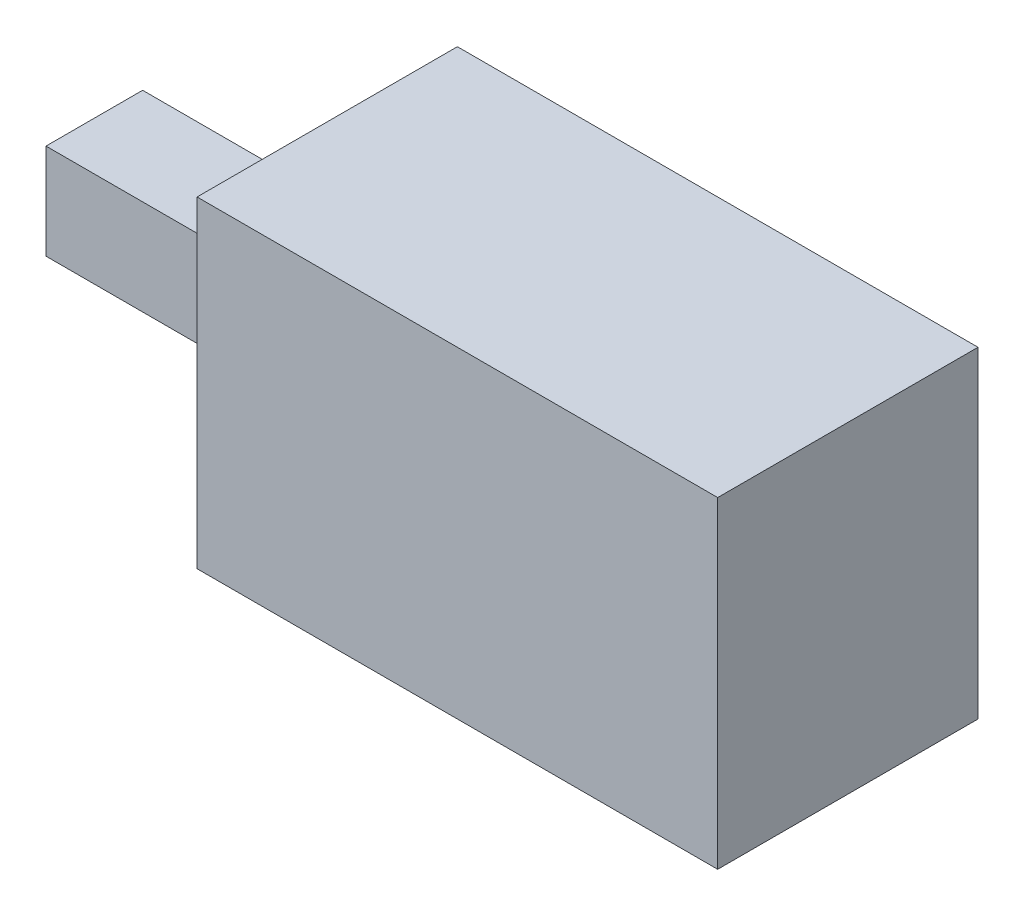
ISO-10303-21;
HEADER;
FILE_DESCRIPTION(('STEP AP214'),'2;1');
FILE_NAME('part.step','',(''),(''),'','','');
FILE_SCHEMA(('AUTOMOTIVE_DESIGN { 1 0 10303 214 1 1 1 1 }'));
ENDSEC;
DATA;
#1=APPLICATION_CONTEXT('core data for automotive mechanical design processes');
#2=APPLICATION_PROTOCOL_DEFINITION('international standard','automotive_design',2000,#1);
#3=PRODUCT_CONTEXT('',#1,'mechanical');
#4=PRODUCT('Part','Part','',(#3));
#5=PRODUCT_RELATED_PRODUCT_CATEGORY('part','',(#4));
#6=PRODUCT_DEFINITION_FORMATION('','',#4);
#7=PRODUCT_DEFINITION_CONTEXT('part definition',#1,'design');
#8=PRODUCT_DEFINITION('design','',#6,#7);
#9=PRODUCT_DEFINITION_SHAPE('','',#8);
#10=(LENGTH_UNIT() NAMED_UNIT(*) SI_UNIT(.MILLI.,.METRE.));
#11=(NAMED_UNIT(*) PLANE_ANGLE_UNIT() SI_UNIT($,.RADIAN.));
#12=(NAMED_UNIT(*) SI_UNIT($,.STERADIAN.) SOLID_ANGLE_UNIT());
#13=UNCERTAINTY_MEASURE_WITH_UNIT(LENGTH_MEASURE(1.E-05),#10,'distance_accuracy_value','');
#14=(GEOMETRIC_REPRESENTATION_CONTEXT(3) GLOBAL_UNCERTAINTY_ASSIGNED_CONTEXT((#13)) GLOBAL_UNIT_ASSIGNED_CONTEXT((#10,
#11,#12)) REPRESENTATION_CONTEXT('',''));
#15=CARTESIAN_POINT('',(0.,0.,0.));
#16=DIRECTION('',(0.,0.,1.));
#17=DIRECTION('',(1.,0.,0.));
#18=AXIS2_PLACEMENT_3D('',#15,#16,#17);
#19=CARTESIAN_POINT('',(-38.,47.,-19.));
#20=DIRECTION('',(1.,0.,0.));
#21=DIRECTION('',(0.,0.,-1.));
#22=AXIS2_PLACEMENT_3D('',#19,#20,#21);
#23=PLANE('',#22);
#24=DIRECTION('',(0.,0.,1.));
#25=VECTOR('',#24,1.);
#26=CARTESIAN_POINT('',(-38.,0.,-19.));
#27=LINE('',#26,#25);
#28=CARTESIAN_POINT('',(-38.,0.,-19.));
#29=VERTEX_POINT('',#28);
#30=CARTESIAN_POINT('',(-38.,0.,19.));
#31=VERTEX_POINT('',#30);
#32=EDGE_CURVE('E165',#29,#31,#27,.T.);
#33=ORIENTED_EDGE('',*,*,#32,.T.);
#34=DIRECTION('',(0.,-1.,0.));
#35=VECTOR('',#34,1.);
#36=CARTESIAN_POINT('',(-38.,47.,19.));
#37=LINE('',#36,#35);
#38=CARTESIAN_POINT('',(-38.,47.,19.));
#39=VERTEX_POINT('',#38);
#40=EDGE_CURVE('E168',#39,#31,#37,.T.);
#41=ORIENTED_EDGE('',*,*,#40,.F.);
#42=DIRECTION('',(0.,0.,1.));
#43=VECTOR('',#42,1.);
#44=CARTESIAN_POINT('',(-38.,47.,-19.));
#45=LINE('',#44,#43);
#46=CARTESIAN_POINT('',(-38.,47.,-19.));
#47=VERTEX_POINT('',#46);
#48=EDGE_CURVE('E153',#47,#39,#45,.T.);
#49=ORIENTED_EDGE('',*,*,#48,.F.);
#50=DIRECTION('',(0.,-1.,0.));
#51=VECTOR('',#50,1.);
#52=CARTESIAN_POINT('',(-38.,47.,-19.));
#53=LINE('',#52,#51);
#54=EDGE_CURVE('E53',#47,#29,#53,.T.);
#55=ORIENTED_EDGE('',*,*,#54,.T.);
#56=EDGE_LOOP('',(#33,#41,#49,#55));
#57=FACE_BOUND('',#56,.T.);
#58=DIRECTION('',(0.,1.,0.));
#59=VECTOR('',#58,1.);
#60=CARTESIAN_POINT('',(-38.,30.4621516002449,7.05316011789549));
#61=LINE('',#60,#59);
#62=CARTESIAN_POINT('',(-38.,16.5378483997551,7.05316011789549));
#63=VERTEX_POINT('',#62);
#64=CARTESIAN_POINT('',(-38.,30.4621516002449,7.05316011789549));
#65=VERTEX_POINT('',#64);
#66=EDGE_CURVE('E62',#63,#65,#61,.T.);
#67=ORIENTED_EDGE('',*,*,#66,.F.);
#68=DIRECTION('',(0.,0.,1.));
#69=VECTOR('',#68,1.);
#70=CARTESIAN_POINT('',(-38.,16.5378483997551,-7.05316011789548));
#71=LINE('',#70,#69);
#72=CARTESIAN_POINT('',(-38.,16.5378483997551,-7.05316011789548));
#73=VERTEX_POINT('',#72);
#74=EDGE_CURVE('E63',#73,#63,#71,.T.);
#75=ORIENTED_EDGE('',*,*,#74,.F.);
#76=DIRECTION('',(0.,-1.,0.));
#77=VECTOR('',#76,1.);
#78=CARTESIAN_POINT('',(-38.,30.4621516002449,-7.05316011789548));
#79=LINE('',#78,#77);
#80=CARTESIAN_POINT('',(-38.,30.4621516002449,-7.05316011789548));
#81=VERTEX_POINT('',#80);
#82=EDGE_CURVE('E286',#81,#73,#79,.T.);
#83=ORIENTED_EDGE('',*,*,#82,.F.);
#84=DIRECTION('',(0.,0.,-1.));
#85=VECTOR('',#84,1.);
#86=CARTESIAN_POINT('',(-38.,30.4621516002449,-7.05316011789548));
#87=LINE('',#86,#85);
#88=EDGE_CURVE('E296',#65,#81,#87,.T.);
#89=ORIENTED_EDGE('',*,*,#88,.F.);
#90=EDGE_LOOP('',(#67,#75,#83,#89));
#91=FACE_BOUND('',#90,.T.);
#92=ADVANCED_FACE('F44',(#57,#91),#23,.F.);
#93=CARTESIAN_POINT('',(38.,47.,-19.));
#94=DIRECTION('',(-1.,0.,0.));
#95=DIRECTION('',(0.,0.,1.));
#96=AXIS2_PLACEMENT_3D('',#93,#94,#95);
#97=PLANE('',#96);
#98=DIRECTION('',(0.,0.,-1.));
#99=VECTOR('',#98,1.);
#100=CARTESIAN_POINT('',(38.,0.,-19.));
#101=LINE('',#100,#99);
#102=CARTESIAN_POINT('',(38.,0.,19.));
#103=VERTEX_POINT('',#102);
#104=CARTESIAN_POINT('',(38.,0.,-19.));
#105=VERTEX_POINT('',#104);
#106=EDGE_CURVE('E131',#103,#105,#101,.T.);
#107=ORIENTED_EDGE('',*,*,#106,.T.);
#108=DIRECTION('',(0.,-1.,0.));
#109=VECTOR('',#108,1.);
#110=CARTESIAN_POINT('',(38.,47.,-19.));
#111=LINE('',#110,#109);
#112=CARTESIAN_POINT('',(38.,47.,-19.));
#113=VERTEX_POINT('',#112);
#114=EDGE_CURVE('E11',#113,#105,#111,.T.);
#115=ORIENTED_EDGE('',*,*,#114,.F.);
#116=DIRECTION('',(0.,0.,-1.));
#117=VECTOR('',#116,1.);
#118=CARTESIAN_POINT('',(38.,47.,-19.));
#119=LINE('',#118,#117);
#120=CARTESIAN_POINT('',(38.,47.,19.));
#121=VERTEX_POINT('',#120);
#122=EDGE_CURVE('E144',#121,#113,#119,.T.);
#123=ORIENTED_EDGE('',*,*,#122,.F.);
#124=DIRECTION('',(0.,-1.,0.));
#125=VECTOR('',#124,1.);
#126=CARTESIAN_POINT('',(38.,47.,19.));
#127=LINE('',#126,#125);
#128=EDGE_CURVE('E158',#121,#103,#127,.T.);
#129=ORIENTED_EDGE('',*,*,#128,.T.);
#130=EDGE_LOOP('',(#107,#115,#123,#129));
#131=FACE_BOUND('',#130,.T.);
#132=ADVANCED_FACE('F50',(#131),#97,.F.);
#133=CARTESIAN_POINT('',(-38.,47.,-19.));
#134=DIRECTION('',(0.,0.,1.));
#135=DIRECTION('',(1.,0.,0.));
#136=AXIS2_PLACEMENT_3D('',#133,#134,#135);
#137=PLANE('',#136);
#138=DIRECTION('',(-1.,0.,0.));
#139=VECTOR('',#138,1.);
#140=CARTESIAN_POINT('',(-38.,0.,-19.));
#141=LINE('',#140,#139);
#142=EDGE_CURVE('E136',#105,#29,#141,.T.);
#143=ORIENTED_EDGE('',*,*,#142,.T.);
#144=ORIENTED_EDGE('',*,*,#54,.F.);
#145=DIRECTION('',(-1.,0.,0.));
#146=VECTOR('',#145,1.);
#147=CARTESIAN_POINT('',(-38.,47.,-19.));
#148=LINE('',#147,#146);
#149=EDGE_CURVE('E149',#113,#47,#148,.T.);
#150=ORIENTED_EDGE('',*,*,#149,.F.);
#151=ORIENTED_EDGE('',*,*,#114,.T.);
#152=EDGE_LOOP('',(#143,#144,#150,#151));
#153=FACE_BOUND('',#152,.T.);
#154=ADVANCED_FACE('F191',(#153),#137,.F.);
#155=CARTESIAN_POINT('',(-38.,47.,19.));
#156=DIRECTION('',(0.,0.,-1.));
#157=DIRECTION('',(-1.,0.,0.));
#158=AXIS2_PLACEMENT_3D('',#155,#156,#157);
#159=PLANE('',#158);
#160=DIRECTION('',(1.,0.,0.));
#161=VECTOR('',#160,1.);
#162=CARTESIAN_POINT('',(-38.,0.,19.));
#163=LINE('',#162,#161);
#164=EDGE_CURVE('E147',#31,#103,#163,.T.);
#165=ORIENTED_EDGE('',*,*,#164,.T.);
#166=ORIENTED_EDGE('',*,*,#128,.F.);
#167=DIRECTION('',(1.,0.,0.));
#168=VECTOR('',#167,1.);
#169=CARTESIAN_POINT('',(-38.,47.,19.));
#170=LINE('',#169,#168);
#171=EDGE_CURVE('E156',#39,#121,#170,.T.);
#172=ORIENTED_EDGE('',*,*,#171,.F.);
#173=ORIENTED_EDGE('',*,*,#40,.T.);
#174=EDGE_LOOP('',(#165,#166,#172,#173));
#175=FACE_BOUND('',#174,.T.);
#176=ADVANCED_FACE('F190',(#175),#159,.F.);
#177=CARTESIAN_POINT('',(0.,47.,0.));
#178=DIRECTION('',(0.,1.,0.));
#179=DIRECTION('',(0.,0.,1.));
#180=AXIS2_PLACEMENT_3D('',#177,#178,#179);
#181=PLANE('',#180);
#182=ORIENTED_EDGE('',*,*,#122,.T.);
#183=ORIENTED_EDGE('',*,*,#149,.T.);
#184=ORIENTED_EDGE('',*,*,#48,.T.);
#185=ORIENTED_EDGE('',*,*,#171,.T.);
#186=EDGE_LOOP('',(#182,#183,#184,#185));
#187=FACE_BOUND('',#186,.T.);
#188=ADVANCED_FACE('F195',(#187),#181,.T.);
#189=CARTESIAN_POINT('',(0.,0.,0.));
#190=DIRECTION('',(0.,1.,0.));
#191=DIRECTION('',(0.,0.,1.));
#192=AXIS2_PLACEMENT_3D('',#189,#190,#191);
#193=PLANE('',#192);
#194=ORIENTED_EDGE('',*,*,#106,.F.);
#195=ORIENTED_EDGE('',*,*,#164,.F.);
#196=ORIENTED_EDGE('',*,*,#32,.F.);
#197=ORIENTED_EDGE('',*,*,#142,.F.);
#198=EDGE_LOOP('',(#194,#195,#196,#197));
#199=FACE_BOUND('',#198,.T.);
#200=ADVANCED_FACE('F184',(#199),#193,.F.);
#201=CARTESIAN_POINT('',(-72.,30.4621516002449,7.0531601178955));
#202=DIRECTION('',(0.,0.,-1.));
#203=DIRECTION('',(-1.,0.,0.));
#204=AXIS2_PLACEMENT_3D('',#201,#202,#203);
#205=PLANE('',#204);
#206=ORIENTED_EDGE('',*,*,#66,.T.);
#207=DIRECTION('',(1.,0.,0.));
#208=VECTOR('',#207,1.);
#209=CARTESIAN_POINT('',(-72.,30.4621516002449,7.0531601178955));
#210=LINE('',#209,#208);
#211=CARTESIAN_POINT('',(-72.,30.4621516002449,7.0531601178955));
#212=VERTEX_POINT('',#211);
#213=EDGE_CURVE('E111',#212,#65,#210,.T.);
#214=ORIENTED_EDGE('',*,*,#213,.F.);
#215=DIRECTION('',(0.,1.,0.));
#216=VECTOR('',#215,1.);
#217=CARTESIAN_POINT('',(-72.,30.4621516002449,7.0531601178955));
#218=LINE('',#217,#216);
#219=CARTESIAN_POINT('',(-72.,16.5378483997551,7.0531601178955));
#220=VERTEX_POINT('',#219);
#221=EDGE_CURVE('E122',#220,#212,#218,.T.);
#222=ORIENTED_EDGE('',*,*,#221,.F.);
#223=DIRECTION('',(1.,0.,0.));
#224=VECTOR('',#223,1.);
#225=CARTESIAN_POINT('',(-72.,16.5378483997551,7.0531601178955));
#226=LINE('',#225,#224);
#227=EDGE_CURVE('E287',#220,#63,#226,.T.);
#228=ORIENTED_EDGE('',*,*,#227,.T.);
#229=EDGE_LOOP('',(#206,#214,#222,#228));
#230=FACE_BOUND('',#229,.T.);
#231=ADVANCED_FACE('F135',(#230),#205,.F.);
#232=CARTESIAN_POINT('',(-72.,30.4621516002449,-7.05316011789547));
#233=DIRECTION('',(0.,-1.,0.));
#234=DIRECTION('',(0.,0.,-1.));
#235=AXIS2_PLACEMENT_3D('',#232,#233,#234);
#236=PLANE('',#235);
#237=ORIENTED_EDGE('',*,*,#88,.T.);
#238=DIRECTION('',(1.,0.,0.));
#239=VECTOR('',#238,1.);
#240=CARTESIAN_POINT('',(-72.,30.4621516002449,-7.05316011789547));
#241=LINE('',#240,#239);
#242=CARTESIAN_POINT('',(-72.,30.4621516002449,-7.05316011789547));
#243=VERTEX_POINT('',#242);
#244=EDGE_CURVE('E117',#243,#81,#241,.T.);
#245=ORIENTED_EDGE('',*,*,#244,.F.);
#246=DIRECTION('',(0.,0.,-1.));
#247=VECTOR('',#246,1.);
#248=CARTESIAN_POINT('',(-72.,30.4621516002449,-7.05316011789547));
#249=LINE('',#248,#247);
#250=EDGE_CURVE('E108',#212,#243,#249,.T.);
#251=ORIENTED_EDGE('',*,*,#250,.F.);
#252=ORIENTED_EDGE('',*,*,#213,.T.);
#253=EDGE_LOOP('',(#237,#245,#251,#252));
#254=FACE_BOUND('',#253,.T.);
#255=ADVANCED_FACE('F115',(#254),#236,.F.);
#256=CARTESIAN_POINT('',(-72.,30.4621516002449,-7.05316011789547));
#257=DIRECTION('',(0.,0.,1.));
#258=DIRECTION('',(1.,0.,0.));
#259=AXIS2_PLACEMENT_3D('',#256,#257,#258);
#260=PLANE('',#259);
#261=ORIENTED_EDGE('',*,*,#82,.T.);
#262=DIRECTION('',(1.,0.,0.));
#263=VECTOR('',#262,1.);
#264=CARTESIAN_POINT('',(-72.,16.5378483997551,-7.05316011789547));
#265=LINE('',#264,#263);
#266=CARTESIAN_POINT('',(-72.,16.5378483997551,-7.05316011789547));
#267=VERTEX_POINT('',#266);
#268=EDGE_CURVE('E143',#267,#73,#265,.T.);
#269=ORIENTED_EDGE('',*,*,#268,.F.);
#270=DIRECTION('',(0.,-1.,0.));
#271=VECTOR('',#270,1.);
#272=CARTESIAN_POINT('',(-72.,30.4621516002449,-7.05316011789547));
#273=LINE('',#272,#271);
#274=EDGE_CURVE('E118',#243,#267,#273,.T.);
#275=ORIENTED_EDGE('',*,*,#274,.F.);
#276=ORIENTED_EDGE('',*,*,#244,.T.);
#277=EDGE_LOOP('',(#261,#269,#275,#276));
#278=FACE_BOUND('',#277,.T.);
#279=ADVANCED_FACE('F212',(#278),#260,.F.);
#280=CARTESIAN_POINT('',(-72.,16.5378483997551,-7.05316011789547));
#281=DIRECTION('',(0.,1.,0.));
#282=DIRECTION('',(0.,0.,1.));
#283=AXIS2_PLACEMENT_3D('',#280,#281,#282);
#284=PLANE('',#283);
#285=ORIENTED_EDGE('',*,*,#74,.T.);
#286=ORIENTED_EDGE('',*,*,#227,.F.);
#287=DIRECTION('',(0.,0.,1.));
#288=VECTOR('',#287,1.);
#289=CARTESIAN_POINT('',(-72.,16.5378483997551,-7.05316011789547));
#290=LINE('',#289,#288);
#291=EDGE_CURVE('E127',#267,#220,#290,.T.);
#292=ORIENTED_EDGE('',*,*,#291,.F.);
#293=ORIENTED_EDGE('',*,*,#268,.T.);
#294=EDGE_LOOP('',(#285,#286,#292,#293));
#295=FACE_BOUND('',#294,.T.);
#296=ADVANCED_FACE('F220',(#295),#284,.F.);
#297=CARTESIAN_POINT('',(-72.,0.,0.));
#298=DIRECTION('',(-1.,0.,0.));
#299=DIRECTION('',(0.,0.,1.));
#300=AXIS2_PLACEMENT_3D('',#297,#298,#299);
#301=PLANE('',#300);
#302=ORIENTED_EDGE('',*,*,#221,.T.);
#303=ORIENTED_EDGE('',*,*,#250,.T.);
#304=ORIENTED_EDGE('',*,*,#274,.T.);
#305=ORIENTED_EDGE('',*,*,#291,.T.);
#306=EDGE_LOOP('',(#302,#303,#304,#305));
#307=FACE_BOUND('',#306,.T.);
#308=ADVANCED_FACE('F121',(#307),#301,.T.);
#309=CLOSED_SHELL('',(#92,#132,#154,#176,#188,#200,#231,#255,#279,#296,#308));
#310=MANIFOLD_SOLID_BREP('B2',#309);
#311=ADVANCED_BREP_SHAPE_REPRESENTATION('',(#18,#310),#14);
#312=SHAPE_DEFINITION_REPRESENTATION(#9,#311);
ENDSEC;
END-ISO-10303-21;
